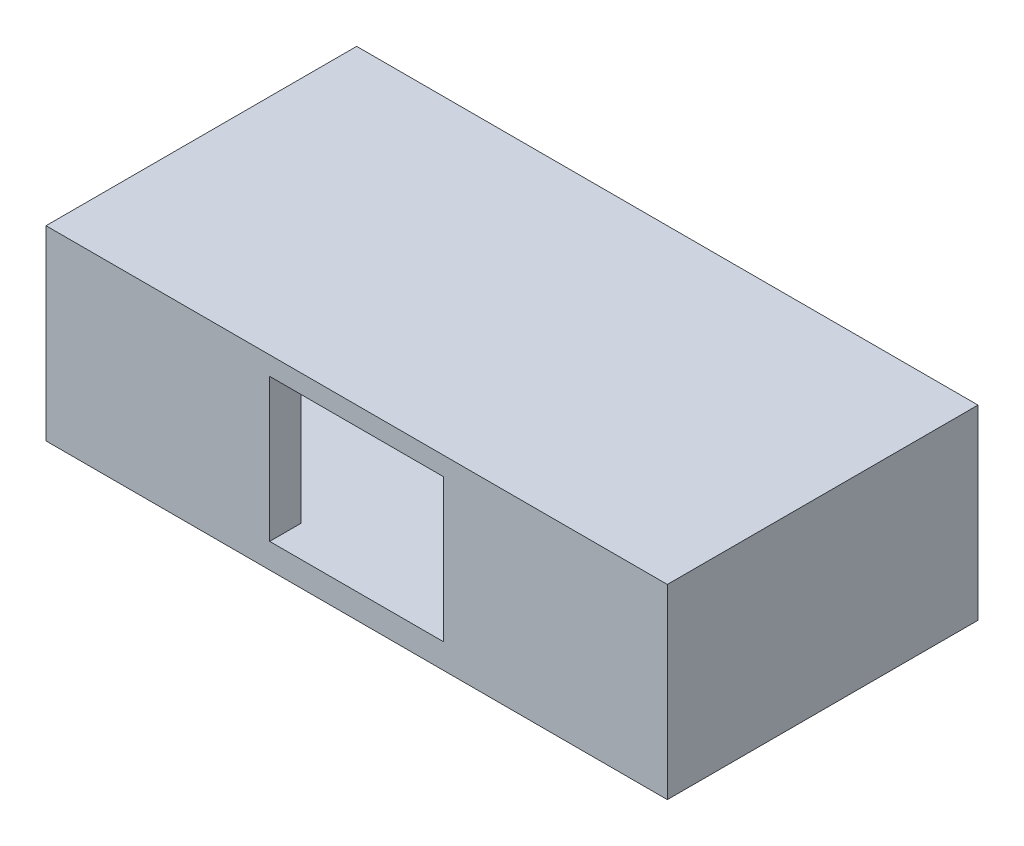
ISO-10303-21;
HEADER;
FILE_DESCRIPTION(('STEP AP214'),'2;1');
FILE_NAME('part.step','',(''),(''),'','','');
FILE_SCHEMA(('AUTOMOTIVE_DESIGN { 1 0 10303 214 1 1 1 1 }'));
ENDSEC;
DATA;
#1=APPLICATION_CONTEXT('core data for automotive mechanical design processes');
#2=APPLICATION_PROTOCOL_DEFINITION('international standard','automotive_design',2000,#1);
#3=PRODUCT_CONTEXT('',#1,'mechanical');
#4=PRODUCT('Part','Part','',(#3));
#5=PRODUCT_RELATED_PRODUCT_CATEGORY('part','',(#4));
#6=PRODUCT_DEFINITION_FORMATION('','',#4);
#7=PRODUCT_DEFINITION_CONTEXT('part definition',#1,'design');
#8=PRODUCT_DEFINITION('design','',#6,#7);
#9=PRODUCT_DEFINITION_SHAPE('','',#8);
#10=(LENGTH_UNIT() NAMED_UNIT(*) SI_UNIT(.MILLI.,.METRE.));
#11=(NAMED_UNIT(*) PLANE_ANGLE_UNIT() SI_UNIT($,.RADIAN.));
#12=(NAMED_UNIT(*) SI_UNIT($,.STERADIAN.) SOLID_ANGLE_UNIT());
#13=UNCERTAINTY_MEASURE_WITH_UNIT(LENGTH_MEASURE(1.E-05),#10,'distance_accuracy_value','');
#14=(GEOMETRIC_REPRESENTATION_CONTEXT(3) GLOBAL_UNCERTAINTY_ASSIGNED_CONTEXT((#13)) GLOBAL_UNIT_ASSIGNED_CONTEXT((#10,
#11,#12)) REPRESENTATION_CONTEXT('',''));
#15=CARTESIAN_POINT('',(0.,0.,0.));
#16=DIRECTION('',(0.,0.,1.));
#17=DIRECTION('',(1.,0.,0.));
#18=AXIS2_PLACEMENT_3D('',#15,#16,#17);
#19=CARTESIAN_POINT('',(-3.00632911392406,2.,-1.80379746835442));
#20=DIRECTION('',(0.,1.,0.));
#21=DIRECTION('',(0.,0.,1.));
#22=AXIS2_PLACEMENT_3D('',#19,#20,#21);
#23=CYLINDRICAL_SURFACE('',#22,10.);
#24=CARTESIAN_POINT('',(-3.00632911392406,14.,-1.80379746835442));
#25=DIRECTION('',(0.,1.,0.));
#26=DIRECTION('',(0.,0.,1.));
#27=AXIS2_PLACEMENT_3D('',#24,#25,#26);
#28=CIRCLE('',#27,10.);
#29=CARTESIAN_POINT('',(-3.00632911392406,14.,-11.8037974683544));
#30=VERTEX_POINT('',#29);
#31=CARTESIAN_POINT('',(-3.00632911392406,14.,8.19620253164558));
#32=VERTEX_POINT('',#31);
#33=EDGE_CURVE('E57',#30,#32,#28,.T.);
#34=ORIENTED_EDGE('',*,*,#33,.T.);
#35=DIRECTION('',(0.,1.,0.));
#36=VECTOR('',#35,1.);
#37=CARTESIAN_POINT('',(-3.00632911392406,2.,8.19620253164558));
#38=LINE('',#37,#36);
#39=CARTESIAN_POINT('',(-3.00632911392406,2.,8.19620253164558));
#40=VERTEX_POINT('',#39);
#41=EDGE_CURVE('E50',#40,#32,#38,.T.);
#42=ORIENTED_EDGE('',*,*,#41,.F.);
#43=CARTESIAN_POINT('',(-3.00632911392406,2.,-1.80379746835442));
#44=DIRECTION('',(0.,1.,0.));
#45=DIRECTION('',(0.,0.,1.));
#46=AXIS2_PLACEMENT_3D('',#43,#44,#45);
#47=CIRCLE('',#46,10.);
#48=CARTESIAN_POINT('',(-3.00632911392406,2.,-11.8037974683544));
#49=VERTEX_POINT('',#48);
#50=EDGE_CURVE('E272',#49,#40,#47,.T.);
#51=ORIENTED_EDGE('',*,*,#50,.F.);
#52=DIRECTION('',(0.,1.,0.));
#53=VECTOR('',#52,1.);
#54=CARTESIAN_POINT('',(-3.00632911392406,2.,-11.8037974683544));
#55=LINE('',#54,#53);
#56=EDGE_CURVE('E11',#49,#30,#55,.T.);
#57=ORIENTED_EDGE('',*,*,#56,.T.);
#58=EDGE_LOOP('',(#34,#42,#51,#57));
#59=FACE_BOUND('',#58,.T.);
#60=ADVANCED_FACE('F40',(#59),#23,.F.);
#61=CARTESIAN_POINT('',(-3.00632911392406,2.,-1.80379746835442));
#62=DIRECTION('',(0.,1.,0.));
#63=DIRECTION('',(0.,0.,1.));
#64=AXIS2_PLACEMENT_3D('',#61,#62,#63);
#65=CYLINDRICAL_SURFACE('',#64,10.);
#66=CARTESIAN_POINT('',(4.49367088607594,14.,4.81058080930706));
#67=VERTEX_POINT('',#66);
#68=EDGE_CURVE('E225',#32,#67,#28,.T.);
#69=ORIENTED_EDGE('',*,*,#68,.T.);
#70=DIRECTION('',(0.,1.,0.));
#71=VECTOR('',#70,1.);
#72=CARTESIAN_POINT('',(4.49367088607594,2.,4.81058080930706));
#73=LINE('',#72,#71);
#74=CARTESIAN_POINT('',(4.49367088607594,13.5,4.81058080930706));
#75=VERTEX_POINT('',#74);
#76=EDGE_CURVE('E210',#75,#67,#73,.T.);
#77=ORIENTED_EDGE('',*,*,#76,.F.);
#78=CARTESIAN_POINT('',(-3.00632911392406,13.5,-1.80379746835442));
#79=DIRECTION('',(0.,-1.,0.));
#80=DIRECTION('',(-1.,0.,0.));
#81=AXIS2_PLACEMENT_3D('',#78,#79,#80);
#82=CIRCLE('',#81,10.);
#83=CARTESIAN_POINT('',(-2.50632911392406,13.5,8.18369470936467));
#84=VERTEX_POINT('',#83);
#85=EDGE_CURVE('E263',#75,#84,#82,.T.);
#86=ORIENTED_EDGE('',*,*,#85,.T.);
#87=DIRECTION('',(0.,-1.,0.));
#88=VECTOR('',#87,1.);
#89=CARTESIAN_POINT('',(-2.50632911392406,2.,8.18369470936467));
#90=LINE('',#89,#88);
#91=CARTESIAN_POINT('',(-2.50632911392406,2.,8.18369470936467));
#92=VERTEX_POINT('',#91);
#93=EDGE_CURVE('E322',#84,#92,#90,.T.);
#94=ORIENTED_EDGE('',*,*,#93,.T.);
#95=CARTESIAN_POINT('',(-3.00632911392406,2.,-1.80379746835442));
#96=DIRECTION('',(0.,1.,0.));
#97=DIRECTION('',(0.,0.,1.));
#98=AXIS2_PLACEMENT_3D('',#95,#96,#97);
#99=CIRCLE('',#98,10.);
#100=EDGE_CURVE('E327',#40,#92,#99,.T.);
#101=ORIENTED_EDGE('',*,*,#100,.F.);
#102=ORIENTED_EDGE('',*,*,#41,.T.);
#103=EDGE_LOOP('',(#69,#77,#86,#94,#101,#102));
#104=FACE_BOUND('',#103,.T.);
#105=ADVANCED_FACE('F413',(#104),#65,.F.);
#106=CARTESIAN_POINT('',(11.9936708860759,2.,-1.80379746835442));
#107=DIRECTION('',(0.,1.,0.));
#108=DIRECTION('',(0.,0.,1.));
#109=AXIS2_PLACEMENT_3D('',#106,#107,#108);
#110=CYLINDRICAL_SURFACE('',#109,10.);
#111=CARTESIAN_POINT('',(11.9936708860759,14.,-1.80379746835442));
#112=DIRECTION('',(0.,1.,0.));
#113=DIRECTION('',(0.,0.,1.));
#114=AXIS2_PLACEMENT_3D('',#111,#112,#113);
#115=CIRCLE('',#114,10.);
#116=CARTESIAN_POINT('',(11.9936708860759,14.,-11.8037974683544));
#117=VERTEX_POINT('',#116);
#118=CARTESIAN_POINT('',(4.49367088607595,14.,-8.4181757460159));
#119=VERTEX_POINT('',#118);
#120=EDGE_CURVE('E214',#117,#119,#115,.T.);
#121=ORIENTED_EDGE('',*,*,#120,.T.);
#122=DIRECTION('',(0.,1.,0.));
#123=VECTOR('',#122,1.);
#124=CARTESIAN_POINT('',(4.49367088607594,2.,-8.4181757460159));
#125=LINE('',#124,#123);
#126=CARTESIAN_POINT('',(4.49367088607594,13.5,-8.4181757460159));
#127=VERTEX_POINT('',#126);
#128=EDGE_CURVE('E201',#127,#119,#125,.T.);
#129=ORIENTED_EDGE('',*,*,#128,.F.);
#130=CARTESIAN_POINT('',(11.9936708860759,13.5,-1.80379746835442));
#131=DIRECTION('',(0.,1.,0.));
#132=DIRECTION('',(0.,0.,1.));
#133=AXIS2_PLACEMENT_3D('',#130,#131,#132);
#134=CIRCLE('',#133,10.);
#135=CARTESIAN_POINT('',(7.99367088607595,13.5,-10.9689488582661));
#136=VERTEX_POINT('',#135);
#137=EDGE_CURVE('E297',#136,#127,#134,.T.);
#138=ORIENTED_EDGE('',*,*,#137,.F.);
#139=DIRECTION('',(0.,1.,0.));
#140=VECTOR('',#139,1.);
#141=CARTESIAN_POINT('',(7.99367088607594,2.,-10.9689488582661));
#142=LINE('',#141,#140);
#143=CARTESIAN_POINT('',(7.99367088607594,2.,-10.9689488582661));
#144=VERTEX_POINT('',#143);
#145=EDGE_CURVE('E260',#144,#136,#142,.T.);
#146=ORIENTED_EDGE('',*,*,#145,.F.);
#147=CARTESIAN_POINT('',(11.9936708860759,2.,-1.80379746835442));
#148=DIRECTION('',(0.,1.,0.));
#149=DIRECTION('',(0.,0.,1.));
#150=AXIS2_PLACEMENT_3D('',#147,#148,#149);
#151=CIRCLE('',#150,10.);
#152=CARTESIAN_POINT('',(11.9936708860759,2.,-11.8037974683544));
#153=VERTEX_POINT('',#152);
#154=EDGE_CURVE('E323',#153,#144,#151,.T.);
#155=ORIENTED_EDGE('',*,*,#154,.F.);
#156=DIRECTION('',(0.,1.,0.));
#157=VECTOR('',#156,1.);
#158=CARTESIAN_POINT('',(11.9936708860759,2.,-11.8037974683544));
#159=LINE('',#158,#157);
#160=EDGE_CURVE('E216',#153,#117,#159,.T.);
#161=ORIENTED_EDGE('',*,*,#160,.T.);
#162=EDGE_LOOP('',(#121,#129,#138,#146,#155,#161));
#163=FACE_BOUND('',#162,.T.);
#164=ADVANCED_FACE('F215',(#163),#110,.F.);
#165=CARTESIAN_POINT('',(11.9936708860759,2.,-1.80379746835442));
#166=DIRECTION('',(0.,1.,0.));
#167=DIRECTION('',(0.,0.,1.));
#168=AXIS2_PLACEMENT_3D('',#165,#166,#167);
#169=CYLINDRICAL_SURFACE('',#168,10.);
#170=CARTESIAN_POINT('',(11.9936708860759,14.,8.19620253164558));
#171=VERTEX_POINT('',#170);
#172=EDGE_CURVE('E65',#171,#117,#115,.T.);
#173=ORIENTED_EDGE('',*,*,#172,.T.);
#174=ORIENTED_EDGE('',*,*,#160,.F.);
#175=CARTESIAN_POINT('',(11.9936708860759,2.,-1.80379746835442));
#176=DIRECTION('',(0.,1.,0.));
#177=DIRECTION('',(0.,0.,1.));
#178=AXIS2_PLACEMENT_3D('',#175,#176,#177);
#179=CIRCLE('',#178,10.);
#180=CARTESIAN_POINT('',(11.9936708860759,2.,8.19620253164558));
#181=VERTEX_POINT('',#180);
#182=EDGE_CURVE('E250',#181,#153,#179,.T.);
#183=ORIENTED_EDGE('',*,*,#182,.F.);
#184=DIRECTION('',(0.,1.,0.));
#185=VECTOR('',#184,1.);
#186=CARTESIAN_POINT('',(11.9936708860759,2.,8.19620253164558));
#187=LINE('',#186,#185);
#188=EDGE_CURVE('E318',#181,#171,#187,.T.);
#189=ORIENTED_EDGE('',*,*,#188,.T.);
#190=EDGE_LOOP('',(#173,#174,#183,#189));
#191=FACE_BOUND('',#190,.T.);
#192=ADVANCED_FACE('F405',(#191),#169,.F.);
#193=CARTESIAN_POINT('',(11.9936708860759,2.,-1.80379746835442));
#194=DIRECTION('',(0.,1.,0.));
#195=DIRECTION('',(0.,0.,1.));
#196=AXIS2_PLACEMENT_3D('',#193,#194,#195);
#197=CYLINDRICAL_SURFACE('',#196,10.);
#198=EDGE_CURVE('E219',#67,#171,#115,.T.);
#199=ORIENTED_EDGE('',*,*,#198,.T.);
#200=ORIENTED_EDGE('',*,*,#188,.F.);
#201=CARTESIAN_POINT('',(11.9936708860759,2.,-1.80379746835442));
#202=DIRECTION('',(0.,1.,0.));
#203=DIRECTION('',(0.,0.,1.));
#204=AXIS2_PLACEMENT_3D('',#201,#202,#203);
#205=CIRCLE('',#204,10.);
#206=CARTESIAN_POINT('',(11.4936708860759,2.,8.18369470936467));
#207=VERTEX_POINT('',#206);
#208=EDGE_CURVE('E211',#207,#181,#205,.T.);
#209=ORIENTED_EDGE('',*,*,#208,.F.);
#210=DIRECTION('',(0.,1.,0.));
#211=VECTOR('',#210,1.);
#212=CARTESIAN_POINT('',(11.4936708860759,2.,8.18369470936467));
#213=LINE('',#212,#211);
#214=CARTESIAN_POINT('',(11.4936708860759,13.5,8.18369470936467));
#215=VERTEX_POINT('',#214);
#216=EDGE_CURVE('E44',#207,#215,#213,.T.);
#217=ORIENTED_EDGE('',*,*,#216,.T.);
#218=CARTESIAN_POINT('',(11.9936708860759,13.5,-1.80379746835442));
#219=DIRECTION('',(0.,-1.,0.));
#220=DIRECTION('',(-1.,0.,0.));
#221=AXIS2_PLACEMENT_3D('',#218,#219,#220);
#222=CIRCLE('',#221,10.);
#223=EDGE_CURVE('E236',#215,#75,#222,.T.);
#224=ORIENTED_EDGE('',*,*,#223,.T.);
#225=ORIENTED_EDGE('',*,*,#76,.T.);
#226=EDGE_LOOP('',(#199,#200,#209,#217,#224,#225));
#227=FACE_BOUND('',#226,.T.);
#228=ADVANCED_FACE('F404',(#227),#197,.F.);
#229=CARTESIAN_POINT('',(-3.00632911392406,2.,-1.80379746835442));
#230=DIRECTION('',(0.,1.,0.));
#231=DIRECTION('',(0.,0.,1.));
#232=AXIS2_PLACEMENT_3D('',#229,#230,#231);
#233=CYLINDRICAL_SURFACE('',#232,10.);
#234=EDGE_CURVE('E205',#119,#30,#28,.T.);
#235=ORIENTED_EDGE('',*,*,#234,.T.);
#236=ORIENTED_EDGE('',*,*,#56,.F.);
#237=CARTESIAN_POINT('',(-3.00632911392406,2.,-1.80379746835442));
#238=DIRECTION('',(0.,1.,0.));
#239=DIRECTION('',(0.,0.,1.));
#240=AXIS2_PLACEMENT_3D('',#237,#238,#239);
#241=CIRCLE('',#240,10.);
#242=CARTESIAN_POINT('',(0.993670886075946,2.,-10.9689488582661));
#243=VERTEX_POINT('',#242);
#244=EDGE_CURVE('E269',#243,#49,#241,.T.);
#245=ORIENTED_EDGE('',*,*,#244,.F.);
#246=DIRECTION('',(0.,-1.,0.));
#247=VECTOR('',#246,1.);
#248=CARTESIAN_POINT('',(0.993670886075944,2.,-10.9689488582661));
#249=LINE('',#248,#247);
#250=CARTESIAN_POINT('',(0.993670886075944,13.5,-10.9689488582661));
#251=VERTEX_POINT('',#250);
#252=EDGE_CURVE('E241',#251,#243,#249,.T.);
#253=ORIENTED_EDGE('',*,*,#252,.F.);
#254=CARTESIAN_POINT('',(-3.00632911392406,13.5,-1.80379746835442));
#255=DIRECTION('',(0.,1.,0.));
#256=DIRECTION('',(0.,0.,1.));
#257=AXIS2_PLACEMENT_3D('',#254,#255,#256);
#258=CIRCLE('',#257,10.);
#259=EDGE_CURVE('E207',#127,#251,#258,.T.);
#260=ORIENTED_EDGE('',*,*,#259,.F.);
#261=ORIENTED_EDGE('',*,*,#128,.T.);
#262=EDGE_LOOP('',(#235,#236,#245,#253,#260,#261));
#263=FACE_BOUND('',#262,.T.);
#264=ADVANCED_FACE('F42',(#263),#233,.F.);
#265=CARTESIAN_POINT('',(-20.506329113924,15.,-14.3037974683544));
#266=DIRECTION('',(1.,0.,0.));
#267=DIRECTION('',(0.,1.,0.));
#268=AXIS2_PLACEMENT_3D('',#265,#266,#267);
#269=PLANE('',#268);
#270=DIRECTION('',(0.,0.,1.));
#271=VECTOR('',#270,1.);
#272=CARTESIAN_POINT('',(-20.506329113924,0.,-14.3037974683544));
#273=LINE('',#272,#271);
#274=CARTESIAN_POINT('',(-20.506329113924,0.,-14.3037974683544));
#275=VERTEX_POINT('',#274);
#276=CARTESIAN_POINT('',(-20.506329113924,0.,10.6962025316456));
#277=VERTEX_POINT('',#276);
#278=EDGE_CURVE('E314',#275,#277,#273,.T.);
#279=ORIENTED_EDGE('',*,*,#278,.T.);
#280=DIRECTION('',(0.,-1.,0.));
#281=VECTOR('',#280,1.);
#282=CARTESIAN_POINT('',(-20.506329113924,15.,10.6962025316456));
#283=LINE('',#282,#281);
#284=CARTESIAN_POINT('',(-20.506329113924,15.,10.6962025316456));
#285=VERTEX_POINT('',#284);
#286=EDGE_CURVE('E287',#285,#277,#283,.T.);
#287=ORIENTED_EDGE('',*,*,#286,.F.);
#288=DIRECTION('',(0.,0.,1.));
#289=VECTOR('',#288,1.);
#290=CARTESIAN_POINT('',(-20.506329113924,15.,-14.3037974683544));
#291=LINE('',#290,#289);
#292=CARTESIAN_POINT('',(-20.506329113924,15.,-14.3037974683544));
#293=VERTEX_POINT('',#292);
#294=EDGE_CURVE('E256',#293,#285,#291,.T.);
#295=ORIENTED_EDGE('',*,*,#294,.F.);
#296=DIRECTION('',(0.,-1.,0.));
#297=VECTOR('',#296,1.);
#298=CARTESIAN_POINT('',(-20.506329113924,15.,-14.3037974683544));
#299=LINE('',#298,#297);
#300=EDGE_CURVE('E307',#293,#275,#299,.T.);
#301=ORIENTED_EDGE('',*,*,#300,.T.);
#302=EDGE_LOOP('',(#279,#287,#295,#301));
#303=FACE_BOUND('',#302,.T.);
#304=ADVANCED_FACE('F432',(#303),#269,.F.);
#305=CARTESIAN_POINT('',(-20.506329113924,15.,10.6962025316456));
#306=DIRECTION('',(0.,0.,-1.));
#307=DIRECTION('',(0.,-1.,0.));
#308=AXIS2_PLACEMENT_3D('',#305,#306,#307);
#309=PLANE('',#308);
#310=DIRECTION('',(1.,0.,0.));
#311=VECTOR('',#310,1.);
#312=CARTESIAN_POINT('',(-20.506329113924,0.,10.6962025316456));
#313=LINE('',#312,#311);
#314=CARTESIAN_POINT('',(29.4936708860759,0.,10.6962025316456));
#315=VERTEX_POINT('',#314);
#316=EDGE_CURVE('E290',#277,#315,#313,.T.);
#317=ORIENTED_EDGE('',*,*,#316,.T.);
#318=DIRECTION('',(0.,-1.,0.));
#319=VECTOR('',#318,1.);
#320=CARTESIAN_POINT('',(29.4936708860759,15.,10.6962025316456));
#321=LINE('',#320,#319);
#322=CARTESIAN_POINT('',(29.4936708860759,15.,10.6962025316456));
#323=VERTEX_POINT('',#322);
#324=EDGE_CURVE('E337',#323,#315,#321,.T.);
#325=ORIENTED_EDGE('',*,*,#324,.F.);
#326=DIRECTION('',(1.,0.,0.));
#327=VECTOR('',#326,1.);
#328=CARTESIAN_POINT('',(-20.506329113924,15.,10.6962025316456));
#329=LINE('',#328,#327);
#330=EDGE_CURVE('E274',#285,#323,#329,.T.);
#331=ORIENTED_EDGE('',*,*,#330,.F.);
#332=ORIENTED_EDGE('',*,*,#286,.T.);
#333=EDGE_LOOP('',(#317,#325,#331,#332));
#334=FACE_BOUND('',#333,.T.);
#335=DIRECTION('',(0.,1.,0.));
#336=VECTOR('',#335,1.);
#337=CARTESIAN_POINT('',(11.4936708860759,13.5,10.6962025316456));
#338=LINE('',#337,#336);
#339=CARTESIAN_POINT('',(11.4936708860759,2.,10.6962025316456));
#340=VERTEX_POINT('',#339);
#341=CARTESIAN_POINT('',(11.4936708860759,13.5,10.6962025316456));
#342=VERTEX_POINT('',#341);
#343=EDGE_CURVE('E303',#340,#342,#338,.T.);
#344=ORIENTED_EDGE('',*,*,#343,.F.);
#345=DIRECTION('',(1.,0.,0.));
#346=VECTOR('',#345,1.);
#347=CARTESIAN_POINT('',(11.4936708860759,2.,10.6962025316456));
#348=LINE('',#347,#346);
#349=CARTESIAN_POINT('',(-2.50632911392406,2.,10.6962025316456));
#350=VERTEX_POINT('',#349);
#351=EDGE_CURVE('E311',#350,#340,#348,.T.);
#352=ORIENTED_EDGE('',*,*,#351,.F.);
#353=DIRECTION('',(0.,-1.,0.));
#354=VECTOR('',#353,1.);
#355=CARTESIAN_POINT('',(-2.50632911392406,13.5,10.6962025316456));
#356=LINE('',#355,#354);
#357=CARTESIAN_POINT('',(-2.50632911392406,13.5,10.6962025316456));
#358=VERTEX_POINT('',#357);
#359=EDGE_CURVE('E242',#358,#350,#356,.T.);
#360=ORIENTED_EDGE('',*,*,#359,.F.);
#361=DIRECTION('',(-1.,0.,0.));
#362=VECTOR('',#361,1.);
#363=CARTESIAN_POINT('',(-2.50632911392406,13.5,10.6962025316456));
#364=LINE('',#363,#362);
#365=EDGE_CURVE('E312',#342,#358,#364,.T.);
#366=ORIENTED_EDGE('',*,*,#365,.F.);
#367=EDGE_LOOP('',(#344,#352,#360,#366));
#368=FACE_BOUND('',#367,.T.);
#369=ADVANCED_FACE('F398',(#334,#368),#309,.F.);
#370=CARTESIAN_POINT('',(29.4936708860759,15.,-14.3037974683544));
#371=DIRECTION('',(1.,0.,0.));
#372=DIRECTION('',(0.,1.,0.));
#373=AXIS2_PLACEMENT_3D('',#370,#371,#372);
#374=PLANE('',#373);
#375=DIRECTION('',(0.,0.,1.));
#376=VECTOR('',#375,1.);
#377=CARTESIAN_POINT('',(29.4936708860759,0.,-14.3037974683544));
#378=LINE('',#377,#376);
#379=CARTESIAN_POINT('',(29.4936708860759,0.,-14.3037974683544));
#380=VERTEX_POINT('',#379);
#381=EDGE_CURVE('E281',#380,#315,#378,.T.);
#382=ORIENTED_EDGE('',*,*,#381,.F.);
#383=DIRECTION('',(0.,-1.,0.));
#384=VECTOR('',#383,1.);
#385=CARTESIAN_POINT('',(29.4936708860759,15.,-14.3037974683544));
#386=LINE('',#385,#384);
#387=CARTESIAN_POINT('',(29.4936708860759,15.,-14.3037974683544));
#388=VERTEX_POINT('',#387);
#389=EDGE_CURVE('E251',#388,#380,#386,.T.);
#390=ORIENTED_EDGE('',*,*,#389,.F.);
#391=DIRECTION('',(0.,0.,1.));
#392=VECTOR('',#391,1.);
#393=CARTESIAN_POINT('',(29.4936708860759,15.,-14.3037974683544));
#394=LINE('',#393,#392);
#395=EDGE_CURVE('E291',#388,#323,#394,.T.);
#396=ORIENTED_EDGE('',*,*,#395,.T.);
#397=ORIENTED_EDGE('',*,*,#324,.T.);
#398=EDGE_LOOP('',(#382,#390,#396,#397));
#399=FACE_BOUND('',#398,.T.);
#400=ADVANCED_FACE('F440',(#399),#374,.T.);
#401=CARTESIAN_POINT('',(-20.506329113924,15.,-14.3037974683544));
#402=DIRECTION('',(0.,0.,-1.));
#403=DIRECTION('',(0.,-1.,0.));
#404=AXIS2_PLACEMENT_3D('',#401,#402,#403);
#405=PLANE('',#404);
#406=DIRECTION('',(1.,0.,0.));
#407=VECTOR('',#406,1.);
#408=CARTESIAN_POINT('',(-20.506329113924,0.,-14.3037974683544));
#409=LINE('',#408,#407);
#410=EDGE_CURVE('E277',#275,#380,#409,.T.);
#411=ORIENTED_EDGE('',*,*,#410,.F.);
#412=ORIENTED_EDGE('',*,*,#300,.F.);
#413=DIRECTION('',(1.,0.,0.));
#414=VECTOR('',#413,1.);
#415=CARTESIAN_POINT('',(-20.506329113924,15.,-14.3037974683544));
#416=LINE('',#415,#414);
#417=EDGE_CURVE('E255',#293,#388,#416,.T.);
#418=ORIENTED_EDGE('',*,*,#417,.T.);
#419=ORIENTED_EDGE('',*,*,#389,.T.);
#420=EDGE_LOOP('',(#411,#412,#418,#419));
#421=FACE_BOUND('',#420,.T.);
#422=DIRECTION('',(1.,0.,0.));
#423=VECTOR('',#422,1.);
#424=CARTESIAN_POINT('',(7.99367088607594,13.5,-14.3037974683544));
#425=LINE('',#424,#423);
#426=CARTESIAN_POINT('',(0.993670886075944,13.5,-14.3037974683544));
#427=VERTEX_POINT('',#426);
#428=CARTESIAN_POINT('',(7.99367088607594,13.5,-14.3037974683544));
#429=VERTEX_POINT('',#428);
#430=EDGE_CURVE('E223',#427,#429,#425,.T.);
#431=ORIENTED_EDGE('',*,*,#430,.F.);
#432=DIRECTION('',(0.,1.,0.));
#433=VECTOR('',#432,1.);
#434=CARTESIAN_POINT('',(0.993670886075944,13.5,-14.3037974683544));
#435=LINE('',#434,#433);
#436=CARTESIAN_POINT('',(0.993670886075946,2.,-14.3037974683544));
#437=VERTEX_POINT('',#436);
#438=EDGE_CURVE('E286',#437,#427,#435,.T.);
#439=ORIENTED_EDGE('',*,*,#438,.F.);
#440=DIRECTION('',(-1.,0.,0.));
#441=VECTOR('',#440,1.);
#442=CARTESIAN_POINT('',(7.99367088607594,2.,-14.3037974683544));
#443=LINE('',#442,#441);
#444=CARTESIAN_POINT('',(7.99367088607594,2.,-14.3037974683544));
#445=VERTEX_POINT('',#444);
#446=EDGE_CURVE('E264',#445,#437,#443,.T.);
#447=ORIENTED_EDGE('',*,*,#446,.F.);
#448=DIRECTION('',(0.,-1.,0.));
#449=VECTOR('',#448,1.);
#450=CARTESIAN_POINT('',(7.99367088607594,13.5,-14.3037974683544));
#451=LINE('',#450,#449);
#452=EDGE_CURVE('E237',#429,#445,#451,.T.);
#453=ORIENTED_EDGE('',*,*,#452,.F.);
#454=EDGE_LOOP('',(#431,#439,#447,#453));
#455=FACE_BOUND('',#454,.T.);
#456=ADVANCED_FACE('F436',(#421,#455),#405,.T.);
#457=CARTESIAN_POINT('',(0.,15.,0.));
#458=DIRECTION('',(0.,1.,0.));
#459=DIRECTION('',(1.,0.,0.));
#460=AXIS2_PLACEMENT_3D('',#457,#458,#459);
#461=PLANE('',#460);
#462=ORIENTED_EDGE('',*,*,#294,.T.);
#463=ORIENTED_EDGE('',*,*,#330,.T.);
#464=ORIENTED_EDGE('',*,*,#395,.F.);
#465=ORIENTED_EDGE('',*,*,#417,.F.);
#466=EDGE_LOOP('',(#462,#463,#464,#465));
#467=FACE_BOUND('',#466,.T.);
#468=ADVANCED_FACE('F439',(#467),#461,.T.);
#469=CARTESIAN_POINT('',(0.,0.,0.));
#470=DIRECTION('',(0.,1.,0.));
#471=DIRECTION('',(1.,0.,0.));
#472=AXIS2_PLACEMENT_3D('',#469,#470,#471);
#473=PLANE('',#472);
#474=ORIENTED_EDGE('',*,*,#278,.F.);
#475=ORIENTED_EDGE('',*,*,#410,.T.);
#476=ORIENTED_EDGE('',*,*,#381,.T.);
#477=ORIENTED_EDGE('',*,*,#316,.F.);
#478=EDGE_LOOP('',(#474,#475,#476,#477));
#479=FACE_BOUND('',#478,.T.);
#480=ADVANCED_FACE('F445',(#479),#473,.F.);
#481=CARTESIAN_POINT('',(4.49367088607594,2.,-1.80379746835442));
#482=DIRECTION('',(0.,1.,0.));
#483=DIRECTION('',(1.,0.,0.));
#484=AXIS2_PLACEMENT_3D('',#481,#482,#483);
#485=PLANE('',#484);
#486=ORIENTED_EDGE('',*,*,#208,.T.);
#487=ORIENTED_EDGE('',*,*,#182,.T.);
#488=ORIENTED_EDGE('',*,*,#154,.T.);
#489=DIRECTION('',(0.,0.,-1.));
#490=VECTOR('',#489,1.);
#491=CARTESIAN_POINT('',(7.99367088607594,2.,10.6972025316456));
#492=LINE('',#491,#490);
#493=EDGE_CURVE('E268',#144,#445,#492,.T.);
#494=ORIENTED_EDGE('',*,*,#493,.T.);
#495=ORIENTED_EDGE('',*,*,#446,.T.);
#496=DIRECTION('',(0.,0.,-1.));
#497=VECTOR('',#496,1.);
#498=CARTESIAN_POINT('',(0.993670886075946,2.,10.6972025316456));
#499=LINE('',#498,#497);
#500=EDGE_CURVE('E282',#243,#437,#499,.T.);
#501=ORIENTED_EDGE('',*,*,#500,.F.);
#502=ORIENTED_EDGE('',*,*,#244,.T.);
#503=ORIENTED_EDGE('',*,*,#50,.T.);
#504=ORIENTED_EDGE('',*,*,#100,.T.);
#505=DIRECTION('',(0.,0.,1.));
#506=VECTOR('',#505,1.);
#507=CARTESIAN_POINT('',(-2.50632911392406,2.,0.696202531645577));
#508=LINE('',#507,#506);
#509=EDGE_CURVE('E330',#92,#350,#508,.T.);
#510=ORIENTED_EDGE('',*,*,#509,.T.);
#511=ORIENTED_EDGE('',*,*,#351,.T.);
#512=DIRECTION('',(0.,0.,1.));
#513=VECTOR('',#512,1.);
#514=CARTESIAN_POINT('',(11.4936708860759,2.,0.696202531645577));
#515=LINE('',#514,#513);
#516=EDGE_CURVE('E246',#207,#340,#515,.T.);
#517=ORIENTED_EDGE('',*,*,#516,.F.);
#518=EDGE_LOOP('',(#486,#487,#488,#494,#495,#501,#502,#503,#504,#510,#511,#517));
#519=FACE_BOUND('',#518,.T.);
#520=ADVANCED_FACE('F389',(#519),#485,.T.);
#521=CARTESIAN_POINT('',(-2.50632911392406,13.5,0.696202531645577));
#522=DIRECTION('',(0.,1.,0.));
#523=DIRECTION('',(1.,0.,0.));
#524=AXIS2_PLACEMENT_3D('',#521,#522,#523);
#525=PLANE('',#524);
#526=DIRECTION('',(0.,0.,1.));
#527=VECTOR('',#526,1.);
#528=CARTESIAN_POINT('',(11.4936708860759,13.5,0.696202531645577));
#529=LINE('',#528,#527);
#530=EDGE_CURVE('E308',#215,#342,#529,.T.);
#531=ORIENTED_EDGE('',*,*,#530,.T.);
#532=ORIENTED_EDGE('',*,*,#365,.T.);
#533=DIRECTION('',(0.,0.,1.));
#534=VECTOR('',#533,1.);
#535=CARTESIAN_POINT('',(-2.50632911392406,13.5,0.696202531645577));
#536=LINE('',#535,#534);
#537=EDGE_CURVE('E245',#84,#358,#536,.T.);
#538=ORIENTED_EDGE('',*,*,#537,.F.);
#539=ORIENTED_EDGE('',*,*,#85,.F.);
#540=ORIENTED_EDGE('',*,*,#223,.F.);
#541=EDGE_LOOP('',(#531,#532,#538,#539,#540));
#542=FACE_BOUND('',#541,.T.);
#543=ADVANCED_FACE('F423',(#542),#525,.F.);
#544=CARTESIAN_POINT('',(-2.50632911392406,13.5,0.696202531645577));
#545=DIRECTION('',(-1.,0.,0.));
#546=DIRECTION('',(0.,1.,0.));
#547=AXIS2_PLACEMENT_3D('',#544,#545,#546);
#548=PLANE('',#547);
#549=ORIENTED_EDGE('',*,*,#537,.T.);
#550=ORIENTED_EDGE('',*,*,#359,.T.);
#551=ORIENTED_EDGE('',*,*,#509,.F.);
#552=ORIENTED_EDGE('',*,*,#93,.F.);
#553=EDGE_LOOP('',(#549,#550,#551,#552));
#554=FACE_BOUND('',#553,.T.);
#555=ADVANCED_FACE('F394',(#554),#548,.F.);
#556=CARTESIAN_POINT('',(11.4936708860759,13.5,0.696202531645577));
#557=DIRECTION('',(1.,0.,0.));
#558=DIRECTION('',(0.,1.,0.));
#559=AXIS2_PLACEMENT_3D('',#556,#557,#558);
#560=PLANE('',#559);
#561=ORIENTED_EDGE('',*,*,#516,.T.);
#562=ORIENTED_EDGE('',*,*,#343,.T.);
#563=ORIENTED_EDGE('',*,*,#530,.F.);
#564=ORIENTED_EDGE('',*,*,#216,.F.);
#565=EDGE_LOOP('',(#561,#562,#563,#564));
#566=FACE_BOUND('',#565,.T.);
#567=ADVANCED_FACE('F401',(#566),#560,.F.);
#568=CARTESIAN_POINT('',(7.99367088607594,13.5,10.6972025316456));
#569=DIRECTION('',(1.,0.,0.));
#570=DIRECTION('',(0.,0.,1.));
#571=AXIS2_PLACEMENT_3D('',#568,#569,#570);
#572=PLANE('',#571);
#573=ORIENTED_EDGE('',*,*,#145,.T.);
#574=DIRECTION('',(0.,0.,-1.));
#575=VECTOR('',#574,1.);
#576=CARTESIAN_POINT('',(7.99367088607594,13.5,10.6972025316456));
#577=LINE('',#576,#575);
#578=EDGE_CURVE('E240',#136,#429,#577,.T.);
#579=ORIENTED_EDGE('',*,*,#578,.T.);
#580=ORIENTED_EDGE('',*,*,#452,.T.);
#581=ORIENTED_EDGE('',*,*,#493,.F.);
#582=EDGE_LOOP('',(#573,#579,#580,#581));
#583=FACE_BOUND('',#582,.T.);
#584=ADVANCED_FACE('F427',(#583),#572,.F.);
#585=CARTESIAN_POINT('',(0.993670886075944,13.5,10.6972025316456));
#586=DIRECTION('',(-1.,0.,0.));
#587=DIRECTION('',(0.,1.,0.));
#588=AXIS2_PLACEMENT_3D('',#585,#586,#587);
#589=PLANE('',#588);
#590=ORIENTED_EDGE('',*,*,#252,.T.);
#591=ORIENTED_EDGE('',*,*,#500,.T.);
#592=ORIENTED_EDGE('',*,*,#438,.T.);
#593=DIRECTION('',(0.,0.,-1.));
#594=VECTOR('',#593,1.);
#595=CARTESIAN_POINT('',(0.993670886075944,13.5,10.6972025316456));
#596=LINE('',#595,#594);
#597=EDGE_CURVE('E227',#251,#427,#596,.T.);
#598=ORIENTED_EDGE('',*,*,#597,.F.);
#599=EDGE_LOOP('',(#590,#591,#592,#598));
#600=FACE_BOUND('',#599,.T.);
#601=ADVANCED_FACE('F430',(#600),#589,.F.);
#602=CARTESIAN_POINT('',(7.99367088607594,13.5,10.6972025316456));
#603=DIRECTION('',(0.,1.,0.));
#604=DIRECTION('',(1.,0.,0.));
#605=AXIS2_PLACEMENT_3D('',#602,#603,#604);
#606=PLANE('',#605);
#607=ORIENTED_EDGE('',*,*,#137,.T.);
#608=ORIENTED_EDGE('',*,*,#259,.T.);
#609=ORIENTED_EDGE('',*,*,#597,.T.);
#610=ORIENTED_EDGE('',*,*,#430,.T.);
#611=ORIENTED_EDGE('',*,*,#578,.F.);
#612=EDGE_LOOP('',(#607,#608,#609,#610,#611));
#613=FACE_BOUND('',#612,.T.);
#614=ADVANCED_FACE('F449',(#613),#606,.F.);
#615=CARTESIAN_POINT('',(4.49367088607594,14.,-1.80379746835442));
#616=DIRECTION('',(0.,1.,0.));
#617=DIRECTION('',(0.,0.,1.));
#618=AXIS2_PLACEMENT_3D('',#615,#616,#617);
#619=PLANE('',#618);
#620=ORIENTED_EDGE('',*,*,#198,.F.);
#621=ORIENTED_EDGE('',*,*,#68,.F.);
#622=ORIENTED_EDGE('',*,*,#33,.F.);
#623=ORIENTED_EDGE('',*,*,#234,.F.);
#624=ORIENTED_EDGE('',*,*,#120,.F.);
#625=ORIENTED_EDGE('',*,*,#172,.F.);
#626=EDGE_LOOP('',(#620,#621,#622,#623,#624,#625));
#627=FACE_BOUND('',#626,.T.);
#628=ADVANCED_FACE('F221',(#627),#619,.F.);
#629=CLOSED_SHELL('',(#60,#105,#164,#192,#228,#264,#304,#369,#400,#456,#468,#480,#520,#543,#555,
#567,#584,#601,#614,#628));
#630=MANIFOLD_SOLID_BREP('B2',#629);
#631=ADVANCED_BREP_SHAPE_REPRESENTATION('',(#18,#630),#14);
#632=SHAPE_DEFINITION_REPRESENTATION(#9,#631);
ENDSEC;
END-ISO-10303-21;
